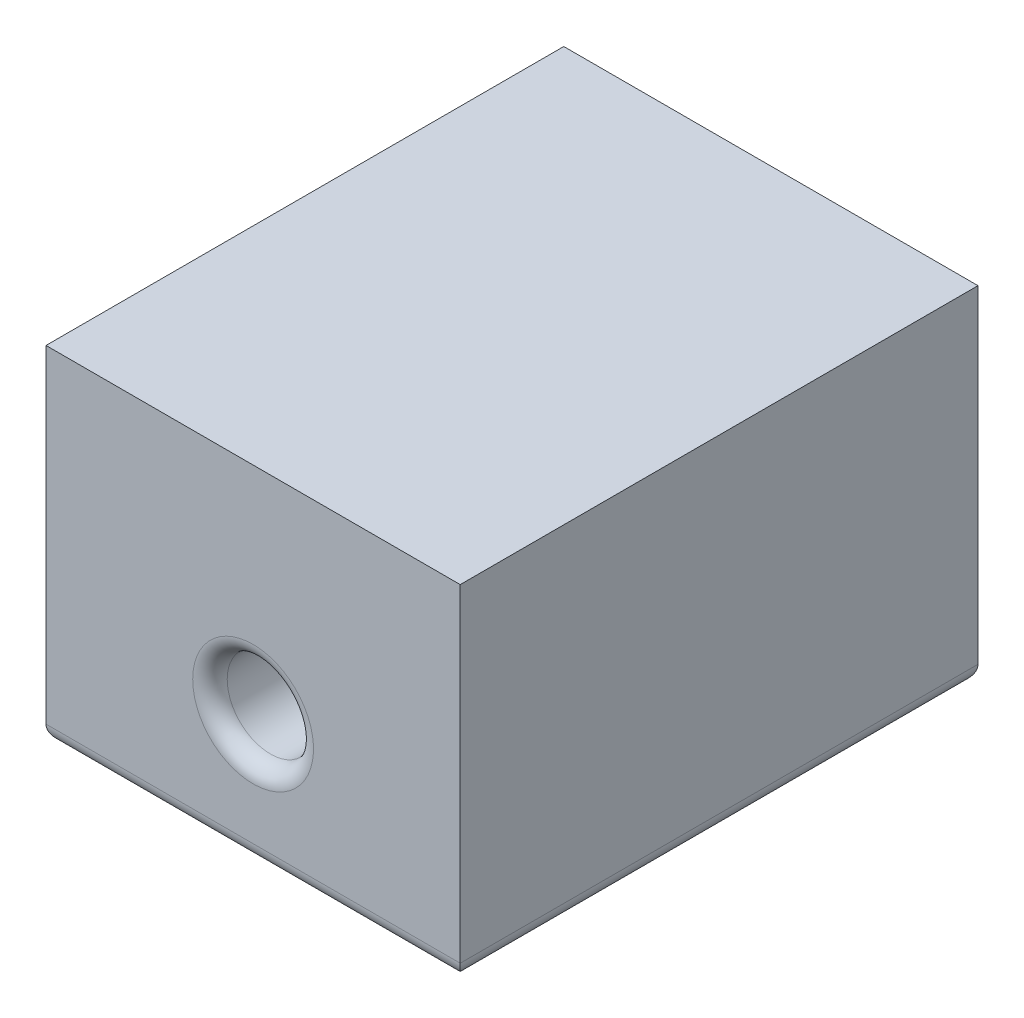
ISO-10303-21;
HEADER;
FILE_DESCRIPTION(('STEP AP214'),'2;1');
FILE_NAME('part.step','',(''),(''),'','','');
FILE_SCHEMA(('AUTOMOTIVE_DESIGN { 1 0 10303 214 1 1 1 1 }'));
ENDSEC;
DATA;
#1=APPLICATION_CONTEXT('core data for automotive mechanical design processes');
#2=APPLICATION_PROTOCOL_DEFINITION('international standard','automotive_design',2000,#1);
#3=PRODUCT_CONTEXT('',#1,'mechanical');
#4=PRODUCT('Part','Part','',(#3));
#5=PRODUCT_RELATED_PRODUCT_CATEGORY('part','',(#4));
#6=PRODUCT_DEFINITION_FORMATION('','',#4);
#7=PRODUCT_DEFINITION_CONTEXT('part definition',#1,'design');
#8=PRODUCT_DEFINITION('design','',#6,#7);
#9=PRODUCT_DEFINITION_SHAPE('','',#8);
#10=(LENGTH_UNIT() NAMED_UNIT(*) SI_UNIT(.MILLI.,.METRE.));
#11=(NAMED_UNIT(*) PLANE_ANGLE_UNIT() SI_UNIT($,.RADIAN.));
#12=(NAMED_UNIT(*) SI_UNIT($,.STERADIAN.) SOLID_ANGLE_UNIT());
#13=UNCERTAINTY_MEASURE_WITH_UNIT(LENGTH_MEASURE(1.E-05),#10,'distance_accuracy_value','');
#14=(GEOMETRIC_REPRESENTATION_CONTEXT(3) GLOBAL_UNCERTAINTY_ASSIGNED_CONTEXT((#13)) GLOBAL_UNIT_ASSIGNED_CONTEXT((#10,
#11,#12)) REPRESENTATION_CONTEXT('',''));
#15=CARTESIAN_POINT('',(0.,0.,0.));
#16=DIRECTION('',(0.,0.,1.));
#17=DIRECTION('',(1.,0.,0.));
#18=AXIS2_PLACEMENT_3D('',#15,#16,#17);
#19=CARTESIAN_POINT('',(0.,20.,0.));
#20=DIRECTION('',(1.,0.,0.));
#21=DIRECTION('',(0.,0.,-1.));
#22=AXIS2_PLACEMENT_3D('',#19,#20,#21);
#23=PLANE('',#22);
#24=DIRECTION('',(0.,-1.,0.));
#25=VECTOR('',#24,1.);
#26=CARTESIAN_POINT('',(0.,20.,-30.));
#27=LINE('',#26,#25);
#28=CARTESIAN_POINT('',(0.,20.,-30.));
#29=VERTEX_POINT('',#28);
#30=CARTESIAN_POINT('',(0.,1.,-30.));
#31=VERTEX_POINT('',#30);
#32=EDGE_CURVE('E176',#29,#31,#27,.T.);
#33=ORIENTED_EDGE('',*,*,#32,.T.);
#34=DIRECTION('',(0.,0.,1.));
#35=VECTOR('',#34,1.);
#36=CARTESIAN_POINT('',(0.,1.,0.));
#37=LINE('',#36,#35);
#38=CARTESIAN_POINT('',(0.,1.,0.));
#39=VERTEX_POINT('',#38);
#40=EDGE_CURVE('E122',#31,#39,#37,.T.);
#41=ORIENTED_EDGE('',*,*,#40,.T.);
#42=DIRECTION('',(0.,-1.,0.));
#43=VECTOR('',#42,1.);
#44=CARTESIAN_POINT('',(0.,20.,0.));
#45=LINE('',#44,#43);
#46=CARTESIAN_POINT('',(0.,20.,0.));
#47=VERTEX_POINT('',#46);
#48=EDGE_CURVE('E107',#47,#39,#45,.T.);
#49=ORIENTED_EDGE('',*,*,#48,.F.);
#50=DIRECTION('',(0.,0.,1.));
#51=VECTOR('',#50,1.);
#52=CARTESIAN_POINT('',(0.,20.,0.));
#53=LINE('',#52,#51);
#54=EDGE_CURVE('E113',#29,#47,#53,.T.);
#55=ORIENTED_EDGE('',*,*,#54,.F.);
#56=EDGE_LOOP('',(#33,#41,#49,#55));
#57=FACE_BOUND('',#56,.T.);
#58=ADVANCED_FACE('F44',(#57),#23,.F.);
#59=CARTESIAN_POINT('',(0.,20.,0.));
#60=DIRECTION('',(0.,0.,-1.));
#61=DIRECTION('',(-1.,0.,0.));
#62=AXIS2_PLACEMENT_3D('',#59,#60,#61);
#63=PLANE('',#62);
#64=CARTESIAN_POINT('',(12.,7.5,0.));
#65=DIRECTION('',(0.,0.,-1.));
#66=DIRECTION('',(-1.,0.,0.));
#67=AXIS2_PLACEMENT_3D('',#64,#65,#66);
#68=CIRCLE('',#67,3.5);
#69=CARTESIAN_POINT('',(8.5,7.5,0.));
#70=VERTEX_POINT('',#69);
#71=EDGE_CURVE('E123',#70,#70,#68,.T.);
#72=ORIENTED_EDGE('',*,*,#71,.T.);
#73=EDGE_LOOP('',(#72));
#74=FACE_BOUND('',#73,.T.);
#75=ORIENTED_EDGE('',*,*,#48,.T.);
#76=DIRECTION('',(1.,0.,0.));
#77=VECTOR('',#76,1.);
#78=CARTESIAN_POINT('',(24.,1.,0.));
#79=LINE('',#78,#77);
#80=CARTESIAN_POINT('',(24.,1.,0.));
#81=VERTEX_POINT('',#80);
#82=EDGE_CURVE('E126',#39,#81,#79,.T.);
#83=ORIENTED_EDGE('',*,*,#82,.T.);
#84=DIRECTION('',(0.,-1.,0.));
#85=VECTOR('',#84,1.);
#86=CARTESIAN_POINT('',(24.,20.,0.));
#87=LINE('',#86,#85);
#88=CARTESIAN_POINT('',(24.,20.,0.));
#89=VERTEX_POINT('',#88);
#90=EDGE_CURVE('E109',#89,#81,#87,.T.);
#91=ORIENTED_EDGE('',*,*,#90,.F.);
#92=DIRECTION('',(1.,0.,0.));
#93=VECTOR('',#92,1.);
#94=CARTESIAN_POINT('',(0.,20.,0.));
#95=LINE('',#94,#93);
#96=EDGE_CURVE('E102',#47,#89,#95,.T.);
#97=ORIENTED_EDGE('',*,*,#96,.F.);
#98=EDGE_LOOP('',(#75,#83,#91,#97));
#99=FACE_BOUND('',#98,.T.);
#100=ADVANCED_FACE('F104',(#74,#99),#63,.F.);
#101=CARTESIAN_POINT('',(24.,20.,0.));
#102=DIRECTION('',(-1.,0.,0.));
#103=DIRECTION('',(0.,0.,1.));
#104=AXIS2_PLACEMENT_3D('',#101,#102,#103);
#105=PLANE('',#104);
#106=ORIENTED_EDGE('',*,*,#90,.T.);
#107=DIRECTION('',(0.,0.,-1.));
#108=VECTOR('',#107,1.);
#109=CARTESIAN_POINT('',(24.,1.,-30.));
#110=LINE('',#109,#108);
#111=CARTESIAN_POINT('',(24.,1.,-30.));
#112=VERTEX_POINT('',#111);
#113=EDGE_CURVE('E69',#81,#112,#110,.T.);
#114=ORIENTED_EDGE('',*,*,#113,.T.);
#115=DIRECTION('',(0.,-1.,0.));
#116=VECTOR('',#115,1.);
#117=CARTESIAN_POINT('',(24.,20.,-30.));
#118=LINE('',#117,#116);
#119=CARTESIAN_POINT('',(24.,20.,-30.));
#120=VERTEX_POINT('',#119);
#121=EDGE_CURVE('E128',#120,#112,#118,.T.);
#122=ORIENTED_EDGE('',*,*,#121,.F.);
#123=DIRECTION('',(0.,0.,-1.));
#124=VECTOR('',#123,1.);
#125=CARTESIAN_POINT('',(24.,20.,0.));
#126=LINE('',#125,#124);
#127=EDGE_CURVE('E112',#89,#120,#126,.T.);
#128=ORIENTED_EDGE('',*,*,#127,.F.);
#129=EDGE_LOOP('',(#106,#114,#122,#128));
#130=FACE_BOUND('',#129,.T.);
#131=ADVANCED_FACE('F174',(#130),#105,.F.);
#132=CARTESIAN_POINT('',(0.,20.,-30.));
#133=DIRECTION('',(0.,0.,1.));
#134=DIRECTION('',(1.,0.,0.));
#135=AXIS2_PLACEMENT_3D('',#132,#133,#134);
#136=PLANE('',#135);
#137=CARTESIAN_POINT('',(12.,7.5,-30.));
#138=DIRECTION('',(0.,0.,1.));
#139=DIRECTION('',(1.,0.,0.));
#140=AXIS2_PLACEMENT_3D('',#137,#138,#139);
#141=CIRCLE('',#140,3.5);
#142=CARTESIAN_POINT('',(15.5,7.5,-30.));
#143=VERTEX_POINT('',#142);
#144=EDGE_CURVE('E143',#143,#143,#141,.T.);
#145=ORIENTED_EDGE('',*,*,#144,.T.);
#146=EDGE_LOOP('',(#145));
#147=FACE_BOUND('',#146,.T.);
#148=ORIENTED_EDGE('',*,*,#121,.T.);
#149=DIRECTION('',(-1.,0.,0.));
#150=VECTOR('',#149,1.);
#151=CARTESIAN_POINT('',(0.,1.,-30.));
#152=LINE('',#151,#150);
#153=EDGE_CURVE('E61',#112,#31,#152,.T.);
#154=ORIENTED_EDGE('',*,*,#153,.T.);
#155=ORIENTED_EDGE('',*,*,#32,.F.);
#156=DIRECTION('',(-1.,0.,0.));
#157=VECTOR('',#156,1.);
#158=CARTESIAN_POINT('',(0.,20.,-30.));
#159=LINE('',#158,#157);
#160=EDGE_CURVE('E118',#120,#29,#159,.T.);
#161=ORIENTED_EDGE('',*,*,#160,.F.);
#162=EDGE_LOOP('',(#148,#154,#155,#161));
#163=FACE_BOUND('',#162,.T.);
#164=ADVANCED_FACE('F179',(#147,#163),#136,.F.);
#165=CARTESIAN_POINT('',(0.,20.,0.));
#166=DIRECTION('',(0.,-1.,0.));
#167=DIRECTION('',(0.,0.,-1.));
#168=AXIS2_PLACEMENT_3D('',#165,#166,#167);
#169=PLANE('',#168);
#170=ORIENTED_EDGE('',*,*,#54,.T.);
#171=ORIENTED_EDGE('',*,*,#96,.T.);
#172=ORIENTED_EDGE('',*,*,#127,.T.);
#173=ORIENTED_EDGE('',*,*,#160,.T.);
#174=EDGE_LOOP('',(#170,#171,#172,#173));
#175=FACE_BOUND('',#174,.T.);
#176=ADVANCED_FACE('F116',(#175),#169,.F.);
#177=CARTESIAN_POINT('',(0.,0.,0.));
#178=DIRECTION('',(0.,-1.,0.));
#179=DIRECTION('',(0.,0.,-1.));
#180=AXIS2_PLACEMENT_3D('',#177,#178,#179);
#181=PLANE('',#180);
#182=DIRECTION('',(0.,0.,-1.));
#183=VECTOR('',#182,1.);
#184=CARTESIAN_POINT('',(23.,0.,0.));
#185=LINE('',#184,#183);
#186=CARTESIAN_POINT('',(23.,0.,-29.));
#187=VERTEX_POINT('',#186);
#188=CARTESIAN_POINT('',(23.,0.,-1.));
#189=VERTEX_POINT('',#188);
#190=EDGE_CURVE('E137',#187,#189,#185,.F.);
#191=ORIENTED_EDGE('',*,*,#190,.T.);
#192=DIRECTION('',(1.,0.,0.));
#193=VECTOR('',#192,1.);
#194=CARTESIAN_POINT('',(0.,0.,-1.));
#195=LINE('',#194,#193);
#196=CARTESIAN_POINT('',(1.,0.,-1.));
#197=VERTEX_POINT('',#196);
#198=EDGE_CURVE('E139',#189,#197,#195,.F.);
#199=ORIENTED_EDGE('',*,*,#198,.T.);
#200=DIRECTION('',(0.,0.,1.));
#201=VECTOR('',#200,1.);
#202=CARTESIAN_POINT('',(1.,0.,-30.));
#203=LINE('',#202,#201);
#204=CARTESIAN_POINT('',(1.,0.,-29.));
#205=VERTEX_POINT('',#204);
#206=EDGE_CURVE('E133',#197,#205,#203,.F.);
#207=ORIENTED_EDGE('',*,*,#206,.T.);
#208=DIRECTION('',(-1.,0.,0.));
#209=VECTOR('',#208,1.);
#210=CARTESIAN_POINT('',(24.,0.,-29.));
#211=LINE('',#210,#209);
#212=EDGE_CURVE('E135',#205,#187,#211,.F.);
#213=ORIENTED_EDGE('',*,*,#212,.T.);
#214=EDGE_LOOP('',(#191,#199,#207,#213));
#215=FACE_BOUND('',#214,.T.);
#216=ADVANCED_FACE('F167',(#215),#181,.T.);
#217=CARTESIAN_POINT('',(12.,7.5,0.));
#218=DIRECTION('',(0.,0.,-1.));
#219=DIRECTION('',(-1.,0.,0.));
#220=AXIS2_PLACEMENT_3D('',#217,#218,#219);
#221=CYLINDRICAL_SURFACE('',#220,2.5);
#222=CARTESIAN_POINT('',(12.,7.5,-29.));
#223=DIRECTION('',(0.,0.,1.));
#224=DIRECTION('',(1.,0.,0.));
#225=AXIS2_PLACEMENT_3D('',#222,#223,#224);
#226=CIRCLE('',#225,2.5);
#227=CARTESIAN_POINT('',(14.5,7.5,-29.));
#228=VERTEX_POINT('',#227);
#229=EDGE_CURVE('E13',#228,#228,#226,.F.);
#230=ORIENTED_EDGE('',*,*,#229,.T.);
#231=EDGE_LOOP('',(#230));
#232=FACE_BOUND('',#231,.T.);
#233=CARTESIAN_POINT('',(12.,7.5,-1.));
#234=DIRECTION('',(0.,0.,-1.));
#235=DIRECTION('',(-1.,0.,0.));
#236=AXIS2_PLACEMENT_3D('',#233,#234,#235);
#237=CIRCLE('',#236,2.5);
#238=CARTESIAN_POINT('',(9.5,7.5,-1.));
#239=VERTEX_POINT('',#238);
#240=EDGE_CURVE('E53',#239,#239,#237,.F.);
#241=ORIENTED_EDGE('',*,*,#240,.T.);
#242=EDGE_LOOP('',(#241));
#243=FACE_BOUND('',#242,.T.);
#244=ADVANCED_FACE('F208',(#232,#243),#221,.F.);
#245=CARTESIAN_POINT('',(0.,1.,-29.));
#246=DIRECTION('',(1.,0.,0.));
#247=DIRECTION('',(0.,0.,-1.));
#248=AXIS2_PLACEMENT_3D('',#245,#246,#247);
#249=CYLINDRICAL_SURFACE('',#248,1.);
#250=CARTESIAN_POINT('',(23.,1.,-29.));
#251=DIRECTION('',(0.707106781186547,0.,0.707106781186547));
#252=DIRECTION('',(0.707106781186547,0.,-0.707106781186547));
#253=AXIS2_PLACEMENT_3D('',#250,#251,#252);
#254=ELLIPSE('',#253,1.41421356237309,1.);
#255=EDGE_CURVE('E153',#187,#112,#254,.T.);
#256=ORIENTED_EDGE('',*,*,#255,.F.);
#257=ORIENTED_EDGE('',*,*,#212,.F.);
#258=CARTESIAN_POINT('',(1.,1.,-29.));
#259=DIRECTION('',(0.707106781186547,0.,-0.707106781186547));
#260=DIRECTION('',(-0.707106781186547,0.,-0.707106781186547));
#261=AXIS2_PLACEMENT_3D('',#258,#259,#260);
#262=ELLIPSE('',#261,1.41421356237309,1.);
#263=EDGE_CURVE('E48',#31,#205,#262,.F.);
#264=ORIENTED_EDGE('',*,*,#263,.F.);
#265=ORIENTED_EDGE('',*,*,#153,.F.);
#266=EDGE_LOOP('',(#256,#257,#264,#265));
#267=FACE_BOUND('',#266,.T.);
#268=ADVANCED_FACE('F165',(#267),#249,.T.);
#269=CARTESIAN_POINT('',(1.,1.,0.));
#270=DIRECTION('',(0.,0.,-1.));
#271=DIRECTION('',(-1.,0.,0.));
#272=AXIS2_PLACEMENT_3D('',#269,#270,#271);
#273=CYLINDRICAL_SURFACE('',#272,1.);
#274=ORIENTED_EDGE('',*,*,#263,.T.);
#275=ORIENTED_EDGE('',*,*,#206,.F.);
#276=CARTESIAN_POINT('',(1.,1.,-1.));
#277=DIRECTION('',(-0.707106781186547,0.,-0.707106781186547));
#278=DIRECTION('',(0.707106781186547,0.,-0.707106781186547));
#279=AXIS2_PLACEMENT_3D('',#276,#277,#278);
#280=ELLIPSE('',#279,1.41421356237309,1.);
#281=EDGE_CURVE('E152',#39,#197,#280,.F.);
#282=ORIENTED_EDGE('',*,*,#281,.F.);
#283=ORIENTED_EDGE('',*,*,#40,.F.);
#284=EDGE_LOOP('',(#274,#275,#282,#283));
#285=FACE_BOUND('',#284,.T.);
#286=ADVANCED_FACE('F162',(#285),#273,.T.);
#287=CARTESIAN_POINT('',(23.,1.,0.));
#288=DIRECTION('',(0.,0.,1.));
#289=DIRECTION('',(1.,0.,0.));
#290=AXIS2_PLACEMENT_3D('',#287,#288,#289);
#291=CYLINDRICAL_SURFACE('',#290,1.);
#292=ORIENTED_EDGE('',*,*,#255,.T.);
#293=ORIENTED_EDGE('',*,*,#113,.F.);
#294=CARTESIAN_POINT('',(23.,1.,-1.));
#295=DIRECTION('',(-0.707106781186547,0.,0.707106781186547));
#296=DIRECTION('',(0.707106781186547,0.,0.707106781186547));
#297=AXIS2_PLACEMENT_3D('',#294,#295,#296);
#298=ELLIPSE('',#297,1.41421356237309,1.);
#299=EDGE_CURVE('E150',#189,#81,#298,.T.);
#300=ORIENTED_EDGE('',*,*,#299,.F.);
#301=ORIENTED_EDGE('',*,*,#190,.F.);
#302=EDGE_LOOP('',(#292,#293,#300,#301));
#303=FACE_BOUND('',#302,.T.);
#304=ADVANCED_FACE('F173',(#303),#291,.T.);
#305=CARTESIAN_POINT('',(0.,1.,-1.));
#306=DIRECTION('',(-1.,0.,0.));
#307=DIRECTION('',(0.,0.,1.));
#308=AXIS2_PLACEMENT_3D('',#305,#306,#307);
#309=CYLINDRICAL_SURFACE('',#308,1.);
#310=ORIENTED_EDGE('',*,*,#281,.T.);
#311=ORIENTED_EDGE('',*,*,#198,.F.);
#312=ORIENTED_EDGE('',*,*,#299,.T.);
#313=ORIENTED_EDGE('',*,*,#82,.F.);
#314=EDGE_LOOP('',(#310,#311,#312,#313));
#315=FACE_BOUND('',#314,.T.);
#316=ADVANCED_FACE('F171',(#315),#309,.T.);
#317=CARTESIAN_POINT('',(12.,7.5,-29.));
#318=DIRECTION('',(0.,0.,1.));
#319=DIRECTION('',(1.,0.,0.));
#320=AXIS2_PLACEMENT_3D('',#317,#318,#319);
#321=TOROIDAL_SURFACE('',#320,3.5,1.);
#322=ORIENTED_EDGE('',*,*,#229,.F.);
#323=EDGE_LOOP('',(#322));
#324=FACE_BOUND('',#323,.T.);
#325=ORIENTED_EDGE('',*,*,#144,.F.);
#326=EDGE_LOOP('',(#325));
#327=FACE_BOUND('',#326,.T.);
#328=ADVANCED_FACE('F202',(#324,#327),#321,.T.);
#329=CARTESIAN_POINT('',(12.,7.5,-1.));
#330=DIRECTION('',(0.,0.,-1.));
#331=DIRECTION('',(-1.,0.,0.));
#332=AXIS2_PLACEMENT_3D('',#329,#330,#331);
#333=TOROIDAL_SURFACE('',#332,3.5,1.);
#334=ORIENTED_EDGE('',*,*,#240,.F.);
#335=EDGE_LOOP('',(#334));
#336=FACE_BOUND('',#335,.T.);
#337=ORIENTED_EDGE('',*,*,#71,.F.);
#338=EDGE_LOOP('',(#337));
#339=FACE_BOUND('',#338,.T.);
#340=ADVANCED_FACE('F46',(#336,#339),#333,.T.);
#341=CLOSED_SHELL('',(#58,#100,#131,#164,#176,#216,#244,#268,#286,#304,#316,#328,#340));
#342=MANIFOLD_SOLID_BREP('B2',#341);
#343=ADVANCED_BREP_SHAPE_REPRESENTATION('',(#18,#342),#14);
#344=SHAPE_DEFINITION_REPRESENTATION(#9,#343);
ENDSEC;
END-ISO-10303-21;
